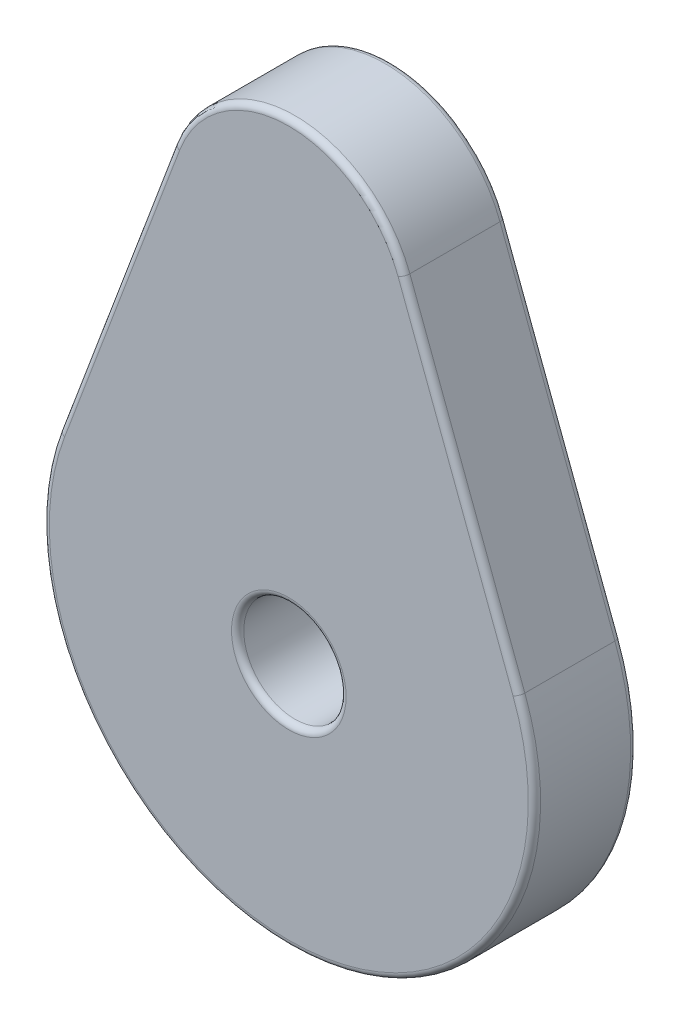
ISO-10303-21;
HEADER;
FILE_DESCRIPTION(('STEP AP214'),'2;1');
FILE_NAME('part.step','',(''),(''),'','','');
FILE_SCHEMA(('AUTOMOTIVE_DESIGN { 1 0 10303 214 1 1 1 1 }'));
ENDSEC;
DATA;
#1=APPLICATION_CONTEXT('core data for automotive mechanical design processes');
#2=APPLICATION_PROTOCOL_DEFINITION('international standard','automotive_design',2000,#1);
#3=PRODUCT_CONTEXT('',#1,'mechanical');
#4=PRODUCT('Part','Part','',(#3));
#5=PRODUCT_RELATED_PRODUCT_CATEGORY('part','',(#4));
#6=PRODUCT_DEFINITION_FORMATION('','',#4);
#7=PRODUCT_DEFINITION_CONTEXT('part definition',#1,'design');
#8=PRODUCT_DEFINITION('design','',#6,#7);
#9=PRODUCT_DEFINITION_SHAPE('','',#8);
#10=(LENGTH_UNIT() NAMED_UNIT(*) SI_UNIT(.MILLI.,.METRE.));
#11=(NAMED_UNIT(*) PLANE_ANGLE_UNIT() SI_UNIT($,.RADIAN.));
#12=(NAMED_UNIT(*) SI_UNIT($,.STERADIAN.) SOLID_ANGLE_UNIT());
#13=UNCERTAINTY_MEASURE_WITH_UNIT(LENGTH_MEASURE(1.E-05),#10,'distance_accuracy_value','');
#14=(GEOMETRIC_REPRESENTATION_CONTEXT(3) GLOBAL_UNCERTAINTY_ASSIGNED_CONTEXT((#13)) GLOBAL_UNIT_ASSIGNED_CONTEXT((#10,
#11,#12)) REPRESENTATION_CONTEXT('',''));
#15=CARTESIAN_POINT('',(0.,0.,0.));
#16=DIRECTION('',(0.,0.,1.));
#17=DIRECTION('',(1.,0.,0.));
#18=AXIS2_PLACEMENT_3D('',#15,#16,#17);
#19=CARTESIAN_POINT('',(0.,0.,12.5));
#20=DIRECTION('',(0.,0.,1.));
#21=DIRECTION('',(1.,0.,0.));
#22=AXIS2_PLACEMENT_3D('',#19,#20,#21);
#23=PLANE('',#22);
#24=CARTESIAN_POINT('',(0.,0.,12.5));
#25=DIRECTION('',(0.,0.,1.));
#26=DIRECTION('',(1.,0.,0.));
#27=AXIS2_PLACEMENT_3D('',#24,#25,#26);
#28=CIRCLE('',#27,14.);
#29=CARTESIAN_POINT('',(14.,0.,12.5));
#30=VERTEX_POINT('',#29);
#31=EDGE_CURVE('E41',#30,#30,#28,.F.);
#32=ORIENTED_EDGE('',*,*,#31,.T.);
#33=EDGE_LOOP('',(#32));
#34=FACE_BOUND('',#33,.T.);
#35=CARTESIAN_POINT('',(0.,85.2245156348068,12.5));
#36=DIRECTION('',(0.,0.,1.));
#37=DIRECTION('',(1.,0.,0.));
#38=AXIS2_PLACEMENT_3D('',#35,#36,#37);
#39=CIRCLE('',#38,28.5);
#40=CARTESIAN_POINT('',(26.6758779468067,95.2568401793514,12.5));
#41=VERTEX_POINT('',#40);
#42=CARTESIAN_POINT('',(-26.6758779468067,95.2568401793514,12.5));
#43=VERTEX_POINT('',#42);
#44=EDGE_CURVE('E48',#41,#43,#39,.T.);
#45=ORIENTED_EDGE('',*,*,#44,.T.);
#46=DIRECTION('',(-0.352011387527882,-0.935995717431814,0.));
#47=VECTOR('',#46,1.);
#48=CARTESIAN_POINT('',(-54.7557494697611,20.5926661703811,12.5));
#49=LINE('',#48,#47);
#50=CARTESIAN_POINT('',(-54.7557494697611,20.5926661703811,12.5));
#51=VERTEX_POINT('',#50);
#52=EDGE_CURVE('E110',#43,#51,#49,.T.);
#53=ORIENTED_EDGE('',*,*,#52,.T.);
#54=CARTESIAN_POINT('',(0.,0.,12.5));
#55=DIRECTION('',(0.,0.,1.));
#56=DIRECTION('',(1.,0.,0.));
#57=AXIS2_PLACEMENT_3D('',#54,#55,#56);
#58=CIRCLE('',#57,58.5);
#59=CARTESIAN_POINT('',(54.7557494697611,20.5926661703811,12.5));
#60=VERTEX_POINT('',#59);
#61=EDGE_CURVE('E134',#51,#60,#58,.T.);
#62=ORIENTED_EDGE('',*,*,#61,.T.);
#63=DIRECTION('',(-0.352011387527882,0.935995717431814,0.));
#64=VECTOR('',#63,1.);
#65=CARTESIAN_POINT('',(26.6758779468067,95.2568401793514,12.5));
#66=LINE('',#65,#64);
#67=EDGE_CURVE('E53',#60,#41,#66,.T.);
#68=ORIENTED_EDGE('',*,*,#67,.T.);
#69=EDGE_LOOP('',(#45,#53,#62,#68));
#70=FACE_BOUND('',#69,.T.);
#71=ADVANCED_FACE('F33',(#34,#70),#23,.T.);
#72=CARTESIAN_POINT('',(0.,0.,-12.5));
#73=DIRECTION('',(0.,0.,1.));
#74=DIRECTION('',(1.,0.,0.));
#75=AXIS2_PLACEMENT_3D('',#72,#73,#74);
#76=PLANE('',#75);
#77=CARTESIAN_POINT('',(0.,0.,-12.5));
#78=DIRECTION('',(0.,0.,1.));
#79=DIRECTION('',(1.,0.,0.));
#80=AXIS2_PLACEMENT_3D('',#77,#78,#79);
#81=CIRCLE('',#80,14.);
#82=CARTESIAN_POINT('',(14.,0.,-12.5));
#83=VERTEX_POINT('',#82);
#84=EDGE_CURVE('E11',#83,#83,#81,.T.);
#85=ORIENTED_EDGE('',*,*,#84,.T.);
#86=EDGE_LOOP('',(#85));
#87=FACE_BOUND('',#86,.T.);
#88=CARTESIAN_POINT('',(0.,0.,-12.5));
#89=DIRECTION('',(0.,0.,1.));
#90=DIRECTION('',(1.,0.,0.));
#91=AXIS2_PLACEMENT_3D('',#88,#89,#90);
#92=CIRCLE('',#91,58.5);
#93=CARTESIAN_POINT('',(54.7557494697611,20.5926661703811,-12.5));
#94=VERTEX_POINT('',#93);
#95=CARTESIAN_POINT('',(-54.7557494697611,20.5926661703811,-12.5));
#96=VERTEX_POINT('',#95);
#97=EDGE_CURVE('E177',#94,#96,#92,.F.);
#98=ORIENTED_EDGE('',*,*,#97,.T.);
#99=DIRECTION('',(-0.352011387527882,-0.935995717431814,0.));
#100=VECTOR('',#99,1.);
#101=CARTESIAN_POINT('',(-54.7557494697611,20.5926661703811,-12.5));
#102=LINE('',#101,#100);
#103=CARTESIAN_POINT('',(-26.6758779468067,95.2568401793514,-12.5));
#104=VERTEX_POINT('',#103);
#105=EDGE_CURVE('E179',#96,#104,#102,.F.);
#106=ORIENTED_EDGE('',*,*,#105,.T.);
#107=CARTESIAN_POINT('',(0.,85.2245156348068,-12.5));
#108=DIRECTION('',(0.,0.,1.));
#109=DIRECTION('',(1.,0.,0.));
#110=AXIS2_PLACEMENT_3D('',#107,#108,#109);
#111=CIRCLE('',#110,28.5);
#112=CARTESIAN_POINT('',(26.6758779468067,95.2568401793514,-12.5));
#113=VERTEX_POINT('',#112);
#114=EDGE_CURVE('E194',#104,#113,#111,.F.);
#115=ORIENTED_EDGE('',*,*,#114,.T.);
#116=DIRECTION('',(-0.352011387527882,0.935995717431814,0.));
#117=VECTOR('',#116,1.);
#118=CARTESIAN_POINT('',(54.7557494697611,20.5926661703811,-12.5));
#119=LINE('',#118,#117);
#120=EDGE_CURVE('E181',#113,#94,#119,.F.);
#121=ORIENTED_EDGE('',*,*,#120,.T.);
#122=EDGE_LOOP('',(#98,#106,#115,#121));
#123=FACE_BOUND('',#122,.T.);
#124=ADVANCED_FACE('F171',(#87,#123),#76,.F.);
#125=CARTESIAN_POINT('',(0.,0.,12.5));
#126=DIRECTION('',(0.,0.,-1.));
#127=DIRECTION('',(-1.,0.,0.));
#128=AXIS2_PLACEMENT_3D('',#125,#126,#127);
#129=CYLINDRICAL_SURFACE('',#128,60.);
#130=DIRECTION('',(0.,0.,-1.));
#131=VECTOR('',#130,1.);
#132=CARTESIAN_POINT('',(-56.1597430459088,21.1206832516729,12.5));
#133=LINE('',#132,#131);
#134=CARTESIAN_POINT('',(-56.1597430459088,21.1206832516729,11.));
#135=VERTEX_POINT('',#134);
#136=CARTESIAN_POINT('',(-56.1597430459088,21.1206832516729,-11.));
#137=VERTEX_POINT('',#136);
#138=EDGE_CURVE('E102',#135,#137,#133,.T.);
#139=ORIENTED_EDGE('',*,*,#138,.T.);
#140=CARTESIAN_POINT('',(0.,0.,-11.));
#141=DIRECTION('',(0.,0.,1.));
#142=DIRECTION('',(1.,0.,0.));
#143=AXIS2_PLACEMENT_3D('',#140,#141,#142);
#144=CIRCLE('',#143,60.);
#145=CARTESIAN_POINT('',(56.1597430459088,21.1206832516729,-11.));
#146=VERTEX_POINT('',#145);
#147=EDGE_CURVE('E109',#137,#146,#144,.T.);
#148=ORIENTED_EDGE('',*,*,#147,.T.);
#149=DIRECTION('',(0.,0.,-1.));
#150=VECTOR('',#149,1.);
#151=CARTESIAN_POINT('',(56.1597430459088,21.1206832516729,12.5));
#152=LINE('',#151,#150);
#153=CARTESIAN_POINT('',(56.1597430459088,21.1206832516729,11.));
#154=VERTEX_POINT('',#153);
#155=EDGE_CURVE('E104',#154,#146,#152,.T.);
#156=ORIENTED_EDGE('',*,*,#155,.F.);
#157=CARTESIAN_POINT('',(0.,0.,11.));
#158=DIRECTION('',(0.,0.,1.));
#159=DIRECTION('',(1.,0.,0.));
#160=AXIS2_PLACEMENT_3D('',#157,#158,#159);
#161=CIRCLE('',#160,60.);
#162=EDGE_CURVE('E99',#154,#135,#161,.F.);
#163=ORIENTED_EDGE('',*,*,#162,.T.);
#164=EDGE_LOOP('',(#139,#148,#156,#163));
#165=FACE_BOUND('',#164,.T.);
#166=ADVANCED_FACE('F101',(#165),#129,.T.);
#167=CARTESIAN_POINT('',(56.1597430459088,21.1206832516729,12.5));
#168=DIRECTION('',(-0.935995717431814,-0.352011387527882,0.));
#169=DIRECTION('',(0.352011387527882,-0.935995717431814,0.));
#170=AXIS2_PLACEMENT_3D('',#167,#168,#169);
#171=PLANE('',#170);
#172=ORIENTED_EDGE('',*,*,#155,.T.);
#173=DIRECTION('',(-0.352011387527882,0.935995717431814,0.));
#174=VECTOR('',#173,1.);
#175=CARTESIAN_POINT('',(56.1597430459088,21.1206832516729,-11.));
#176=LINE('',#175,#174);
#177=CARTESIAN_POINT('',(28.0798715229544,95.7848572606433,-11.));
#178=VERTEX_POINT('',#177);
#179=EDGE_CURVE('E209',#146,#178,#176,.T.);
#180=ORIENTED_EDGE('',*,*,#179,.T.);
#181=DIRECTION('',(0.,0.,-1.));
#182=VECTOR('',#181,1.);
#183=CARTESIAN_POINT('',(28.0798715229544,95.7848572606433,12.5));
#184=LINE('',#183,#182);
#185=CARTESIAN_POINT('',(28.0798715229544,95.7848572606433,11.));
#186=VERTEX_POINT('',#185);
#187=EDGE_CURVE('E231',#186,#178,#184,.T.);
#188=ORIENTED_EDGE('',*,*,#187,.F.);
#189=DIRECTION('',(-0.352011387527882,0.935995717431814,0.));
#190=VECTOR('',#189,1.);
#191=CARTESIAN_POINT('',(56.1597430459088,21.1206832516729,11.));
#192=LINE('',#191,#190);
#193=EDGE_CURVE('E216',#186,#154,#192,.F.);
#194=ORIENTED_EDGE('',*,*,#193,.T.);
#195=EDGE_LOOP('',(#172,#180,#188,#194));
#196=FACE_BOUND('',#195,.T.);
#197=ADVANCED_FACE('F233',(#196),#171,.F.);
#198=CARTESIAN_POINT('',(0.,85.2245156348068,12.5));
#199=DIRECTION('',(0.,0.,-1.));
#200=DIRECTION('',(-1.,0.,0.));
#201=AXIS2_PLACEMENT_3D('',#198,#199,#200);
#202=CYLINDRICAL_SURFACE('',#201,30.);
#203=ORIENTED_EDGE('',*,*,#187,.T.);
#204=CARTESIAN_POINT('',(0.,85.2245156348068,-11.));
#205=DIRECTION('',(0.,0.,1.));
#206=DIRECTION('',(1.,0.,0.));
#207=AXIS2_PLACEMENT_3D('',#204,#205,#206);
#208=CIRCLE('',#207,30.);
#209=CARTESIAN_POINT('',(-28.0798715229544,95.7848572606433,-11.));
#210=VERTEX_POINT('',#209);
#211=EDGE_CURVE('E206',#178,#210,#208,.T.);
#212=ORIENTED_EDGE('',*,*,#211,.T.);
#213=DIRECTION('',(0.,0.,-1.));
#214=VECTOR('',#213,1.);
#215=CARTESIAN_POINT('',(-28.0798715229544,95.7848572606433,12.5));
#216=LINE('',#215,#214);
#217=CARTESIAN_POINT('',(-28.0798715229544,95.7848572606433,11.));
#218=VERTEX_POINT('',#217);
#219=EDGE_CURVE('E122',#218,#210,#216,.T.);
#220=ORIENTED_EDGE('',*,*,#219,.F.);
#221=CARTESIAN_POINT('',(0.,85.2245156348068,11.));
#222=DIRECTION('',(0.,0.,1.));
#223=DIRECTION('',(1.,0.,0.));
#224=AXIS2_PLACEMENT_3D('',#221,#222,#223);
#225=CIRCLE('',#224,30.);
#226=EDGE_CURVE('E193',#218,#186,#225,.F.);
#227=ORIENTED_EDGE('',*,*,#226,.T.);
#228=EDGE_LOOP('',(#203,#212,#220,#227));
#229=FACE_BOUND('',#228,.T.);
#230=ADVANCED_FACE('F230',(#229),#202,.T.);
#231=CARTESIAN_POINT('',(-56.1597430459088,21.1206832516729,12.5));
#232=DIRECTION('',(0.935995717431814,-0.352011387527882,0.));
#233=DIRECTION('',(0.352011387527882,0.935995717431814,0.));
#234=AXIS2_PLACEMENT_3D('',#231,#232,#233);
#235=PLANE('',#234);
#236=ORIENTED_EDGE('',*,*,#219,.T.);
#237=DIRECTION('',(-0.352011387527882,-0.935995717431814,0.));
#238=VECTOR('',#237,1.);
#239=CARTESIAN_POINT('',(-56.1597430459088,21.1206832516729,-11.));
#240=LINE('',#239,#238);
#241=EDGE_CURVE('E121',#210,#137,#240,.T.);
#242=ORIENTED_EDGE('',*,*,#241,.T.);
#243=ORIENTED_EDGE('',*,*,#138,.F.);
#244=DIRECTION('',(-0.352011387527882,-0.935995717431814,0.));
#245=VECTOR('',#244,1.);
#246=CARTESIAN_POINT('',(-28.0798715229544,95.7848572606433,11.));
#247=LINE('',#246,#245);
#248=EDGE_CURVE('E118',#135,#218,#247,.F.);
#249=ORIENTED_EDGE('',*,*,#248,.T.);
#250=EDGE_LOOP('',(#236,#242,#243,#249));
#251=FACE_BOUND('',#250,.T.);
#252=ADVANCED_FACE('F117',(#251),#235,.F.);
#253=CARTESIAN_POINT('',(0.,0.,12.5));
#254=DIRECTION('',(0.,0.,-1.));
#255=DIRECTION('',(-1.,0.,0.));
#256=AXIS2_PLACEMENT_3D('',#253,#254,#255);
#257=CYLINDRICAL_SURFACE('',#256,12.5);
#258=CARTESIAN_POINT('',(0.,0.,11.));
#259=DIRECTION('',(0.,0.,1.));
#260=DIRECTION('',(1.,0.,0.));
#261=AXIS2_PLACEMENT_3D('',#258,#259,#260);
#262=CIRCLE('',#261,12.5);
#263=CARTESIAN_POINT('',(12.5,0.,11.));
#264=VERTEX_POINT('',#263);
#265=EDGE_CURVE('E149',#264,#264,#262,.T.);
#266=ORIENTED_EDGE('',*,*,#265,.T.);
#267=EDGE_LOOP('',(#266));
#268=FACE_BOUND('',#267,.T.);
#269=CARTESIAN_POINT('',(0.,0.,-11.));
#270=DIRECTION('',(0.,0.,1.));
#271=DIRECTION('',(1.,0.,0.));
#272=AXIS2_PLACEMENT_3D('',#269,#270,#271);
#273=CIRCLE('',#272,12.5);
#274=CARTESIAN_POINT('',(12.5,0.,-11.));
#275=VERTEX_POINT('',#274);
#276=EDGE_CURVE('E146',#275,#275,#273,.F.);
#277=ORIENTED_EDGE('',*,*,#276,.T.);
#278=EDGE_LOOP('',(#277));
#279=FACE_BOUND('',#278,.T.);
#280=ADVANCED_FACE('F160',(#268,#279),#257,.F.);
#281=CARTESIAN_POINT('',(54.7557494697611,20.5926661703811,-11.));
#282=DIRECTION('',(-0.352011387527882,0.935995717431814,0.));
#283=DIRECTION('',(-0.935995717431814,-0.352011387527882,0.));
#284=AXIS2_PLACEMENT_3D('',#281,#282,#283);
#285=CYLINDRICAL_SURFACE('',#284,1.5);
#286=CARTESIAN_POINT('',(54.7557494697611,20.5926661703811,-11.));
#287=DIRECTION('',(0.352011387527882,-0.935995717431814,0.));
#288=DIRECTION('',(0.935995717431814,0.352011387527882,0.));
#289=AXIS2_PLACEMENT_3D('',#286,#287,#288);
#290=CIRCLE('',#289,1.5);
#291=EDGE_CURVE('E198',#94,#146,#290,.T.);
#292=ORIENTED_EDGE('',*,*,#291,.F.);
#293=ORIENTED_EDGE('',*,*,#120,.F.);
#294=CARTESIAN_POINT('',(26.6758779468067,95.2568401793514,-11.));
#295=DIRECTION('',(-0.352011387527884,0.935995717431813,0.));
#296=DIRECTION('',(-0.935995717431813,-0.352011387527884,0.));
#297=AXIS2_PLACEMENT_3D('',#294,#295,#296);
#298=CIRCLE('',#297,1.5);
#299=EDGE_CURVE('E123',#178,#113,#298,.T.);
#300=ORIENTED_EDGE('',*,*,#299,.F.);
#301=ORIENTED_EDGE('',*,*,#179,.F.);
#302=EDGE_LOOP('',(#292,#293,#300,#301));
#303=FACE_BOUND('',#302,.T.);
#304=ADVANCED_FACE('F163',(#303),#285,.T.);
#305=CARTESIAN_POINT('',(0.,85.2245156348068,-11.));
#306=DIRECTION('',(0.,0.,1.));
#307=DIRECTION('',(1.,0.,0.));
#308=AXIS2_PLACEMENT_3D('',#305,#306,#307);
#309=TOROIDAL_SURFACE('',#308,28.5,1.5);
#310=ORIENTED_EDGE('',*,*,#299,.T.);
#311=ORIENTED_EDGE('',*,*,#114,.F.);
#312=CARTESIAN_POINT('',(-26.6758779468067,95.2568401793514,-11.));
#313=DIRECTION('',(-0.352011387527884,-0.935995717431813,0.));
#314=DIRECTION('',(0.935995717431813,-0.352011387527884,0.));
#315=AXIS2_PLACEMENT_3D('',#312,#313,#314);
#316=CIRCLE('',#315,1.5);
#317=EDGE_CURVE('E191',#210,#104,#316,.T.);
#318=ORIENTED_EDGE('',*,*,#317,.F.);
#319=ORIENTED_EDGE('',*,*,#211,.F.);
#320=EDGE_LOOP('',(#310,#311,#318,#319));
#321=FACE_BOUND('',#320,.T.);
#322=ADVANCED_FACE('F205',(#321),#309,.T.);
#323=CARTESIAN_POINT('',(0.,0.,-11.));
#324=DIRECTION('',(0.,0.,1.));
#325=DIRECTION('',(1.,0.,0.));
#326=AXIS2_PLACEMENT_3D('',#323,#324,#325);
#327=TOROIDAL_SURFACE('',#326,58.5,1.5);
#328=ORIENTED_EDGE('',*,*,#291,.T.);
#329=ORIENTED_EDGE('',*,*,#147,.F.);
#330=CARTESIAN_POINT('',(-54.7557494697611,20.5926661703811,-11.));
#331=DIRECTION('',(0.352011387527882,0.935995717431814,0.));
#332=DIRECTION('',(-0.935995717431814,0.352011387527882,0.));
#333=AXIS2_PLACEMENT_3D('',#330,#331,#332);
#334=CIRCLE('',#333,1.5);
#335=EDGE_CURVE('E145',#96,#137,#334,.T.);
#336=ORIENTED_EDGE('',*,*,#335,.F.);
#337=ORIENTED_EDGE('',*,*,#97,.F.);
#338=EDGE_LOOP('',(#328,#329,#336,#337));
#339=FACE_BOUND('',#338,.T.);
#340=ADVANCED_FACE('F196',(#339),#327,.T.);
#341=CARTESIAN_POINT('',(-54.7557494697611,20.5926661703811,-11.));
#342=DIRECTION('',(-0.352011387527882,-0.935995717431814,0.));
#343=DIRECTION('',(0.935995717431814,-0.352011387527882,0.));
#344=AXIS2_PLACEMENT_3D('',#341,#342,#343);
#345=CYLINDRICAL_SURFACE('',#344,1.5);
#346=ORIENTED_EDGE('',*,*,#317,.T.);
#347=ORIENTED_EDGE('',*,*,#105,.F.);
#348=ORIENTED_EDGE('',*,*,#335,.T.);
#349=ORIENTED_EDGE('',*,*,#241,.F.);
#350=EDGE_LOOP('',(#346,#347,#348,#349));
#351=FACE_BOUND('',#350,.T.);
#352=ADVANCED_FACE('F188',(#351),#345,.T.);
#353=CARTESIAN_POINT('',(54.7557494697611,20.5926661703811,11.));
#354=DIRECTION('',(0.352011387527882,-0.935995717431814,0.));
#355=DIRECTION('',(0.935995717431814,0.352011387527882,0.));
#356=AXIS2_PLACEMENT_3D('',#353,#354,#355);
#357=CYLINDRICAL_SURFACE('',#356,1.5);
#358=CARTESIAN_POINT('',(54.7557494697611,20.5926661703811,11.));
#359=DIRECTION('',(0.352011387527882,-0.935995717431814,0.));
#360=DIRECTION('',(0.935995717431814,0.352011387527882,0.));
#361=AXIS2_PLACEMENT_3D('',#358,#359,#360);
#362=CIRCLE('',#361,1.5);
#363=EDGE_CURVE('E136',#154,#60,#362,.T.);
#364=ORIENTED_EDGE('',*,*,#363,.F.);
#365=ORIENTED_EDGE('',*,*,#193,.F.);
#366=CARTESIAN_POINT('',(26.6758779468067,95.2568401793514,11.));
#367=DIRECTION('',(-0.352011387527884,0.935995717431813,0.));
#368=DIRECTION('',(-0.935995717431813,-0.352011387527884,0.));
#369=AXIS2_PLACEMENT_3D('',#366,#367,#368);
#370=CIRCLE('',#369,1.5);
#371=EDGE_CURVE('E142',#41,#186,#370,.T.);
#372=ORIENTED_EDGE('',*,*,#371,.F.);
#373=ORIENTED_EDGE('',*,*,#67,.F.);
#374=EDGE_LOOP('',(#364,#365,#372,#373));
#375=FACE_BOUND('',#374,.T.);
#376=ADVANCED_FACE('F223',(#375),#357,.T.);
#377=CARTESIAN_POINT('',(0.,85.2245156348068,11.));
#378=DIRECTION('',(0.,0.,1.));
#379=DIRECTION('',(1.,0.,0.));
#380=AXIS2_PLACEMENT_3D('',#377,#378,#379);
#381=TOROIDAL_SURFACE('',#380,28.5,1.5);
#382=ORIENTED_EDGE('',*,*,#371,.T.);
#383=ORIENTED_EDGE('',*,*,#226,.F.);
#384=CARTESIAN_POINT('',(-26.6758779468067,95.2568401793514,11.));
#385=DIRECTION('',(-0.352011387527883,-0.935995717431813,0.));
#386=DIRECTION('',(0.935995717431813,-0.352011387527883,0.));
#387=AXIS2_PLACEMENT_3D('',#384,#385,#386);
#388=CIRCLE('',#387,1.5);
#389=EDGE_CURVE('E130',#43,#218,#388,.T.);
#390=ORIENTED_EDGE('',*,*,#389,.F.);
#391=ORIENTED_EDGE('',*,*,#44,.F.);
#392=EDGE_LOOP('',(#382,#383,#390,#391));
#393=FACE_BOUND('',#392,.T.);
#394=ADVANCED_FACE('F226',(#393),#381,.T.);
#395=CARTESIAN_POINT('',(0.,0.,11.));
#396=DIRECTION('',(0.,0.,1.));
#397=DIRECTION('',(1.,0.,0.));
#398=AXIS2_PLACEMENT_3D('',#395,#396,#397);
#399=TOROIDAL_SURFACE('',#398,58.5,1.5);
#400=ORIENTED_EDGE('',*,*,#363,.T.);
#401=ORIENTED_EDGE('',*,*,#61,.F.);
#402=CARTESIAN_POINT('',(-54.7557494697611,20.5926661703811,11.));
#403=DIRECTION('',(0.352011387527882,0.935995717431814,0.));
#404=DIRECTION('',(-0.935995717431814,0.352011387527882,0.));
#405=AXIS2_PLACEMENT_3D('',#402,#403,#404);
#406=CIRCLE('',#405,1.5);
#407=EDGE_CURVE('E128',#135,#51,#406,.T.);
#408=ORIENTED_EDGE('',*,*,#407,.F.);
#409=ORIENTED_EDGE('',*,*,#162,.F.);
#410=EDGE_LOOP('',(#400,#401,#408,#409));
#411=FACE_BOUND('',#410,.T.);
#412=ADVANCED_FACE('F133',(#411),#399,.T.);
#413=CARTESIAN_POINT('',(-54.7557494697611,20.5926661703811,11.));
#414=DIRECTION('',(0.352011387527882,0.935995717431814,0.));
#415=DIRECTION('',(-0.935995717431814,0.352011387527882,0.));
#416=AXIS2_PLACEMENT_3D('',#413,#414,#415);
#417=CYLINDRICAL_SURFACE('',#416,1.5);
#418=ORIENTED_EDGE('',*,*,#389,.T.);
#419=ORIENTED_EDGE('',*,*,#248,.F.);
#420=ORIENTED_EDGE('',*,*,#407,.T.);
#421=ORIENTED_EDGE('',*,*,#52,.F.);
#422=EDGE_LOOP('',(#418,#419,#420,#421));
#423=FACE_BOUND('',#422,.T.);
#424=ADVANCED_FACE('F126',(#423),#417,.T.);
#425=CARTESIAN_POINT('',(0.,0.,11.));
#426=DIRECTION('',(0.,0.,1.));
#427=DIRECTION('',(1.,0.,0.));
#428=AXIS2_PLACEMENT_3D('',#425,#426,#427);
#429=TOROIDAL_SURFACE('',#428,14.,1.5);
#430=ORIENTED_EDGE('',*,*,#31,.F.);
#431=EDGE_LOOP('',(#430));
#432=FACE_BOUND('',#431,.T.);
#433=ORIENTED_EDGE('',*,*,#265,.F.);
#434=EDGE_LOOP('',(#433));
#435=FACE_BOUND('',#434,.T.);
#436=ADVANCED_FACE('F155',(#432,#435),#429,.T.);
#437=CARTESIAN_POINT('',(0.,0.,-11.));
#438=DIRECTION('',(0.,0.,1.));
#439=DIRECTION('',(1.,0.,0.));
#440=AXIS2_PLACEMENT_3D('',#437,#438,#439);
#441=TOROIDAL_SURFACE('',#440,14.,1.5);
#442=ORIENTED_EDGE('',*,*,#276,.F.);
#443=EDGE_LOOP('',(#442));
#444=FACE_BOUND('',#443,.T.);
#445=ORIENTED_EDGE('',*,*,#84,.F.);
#446=EDGE_LOOP('',(#445));
#447=FACE_BOUND('',#446,.T.);
#448=ADVANCED_FACE('F35',(#444,#447),#441,.T.);
#449=CLOSED_SHELL('',(#71,#124,#166,#197,#230,#252,#280,#304,#322,#340,#352,#376,#394,#412,#424,
#436,#448));
#450=MANIFOLD_SOLID_BREP('B2',#449);
#451=ADVANCED_BREP_SHAPE_REPRESENTATION('',(#18,#450),#14);
#452=SHAPE_DEFINITION_REPRESENTATION(#9,#451);
ENDSEC;
END-ISO-10303-21;
